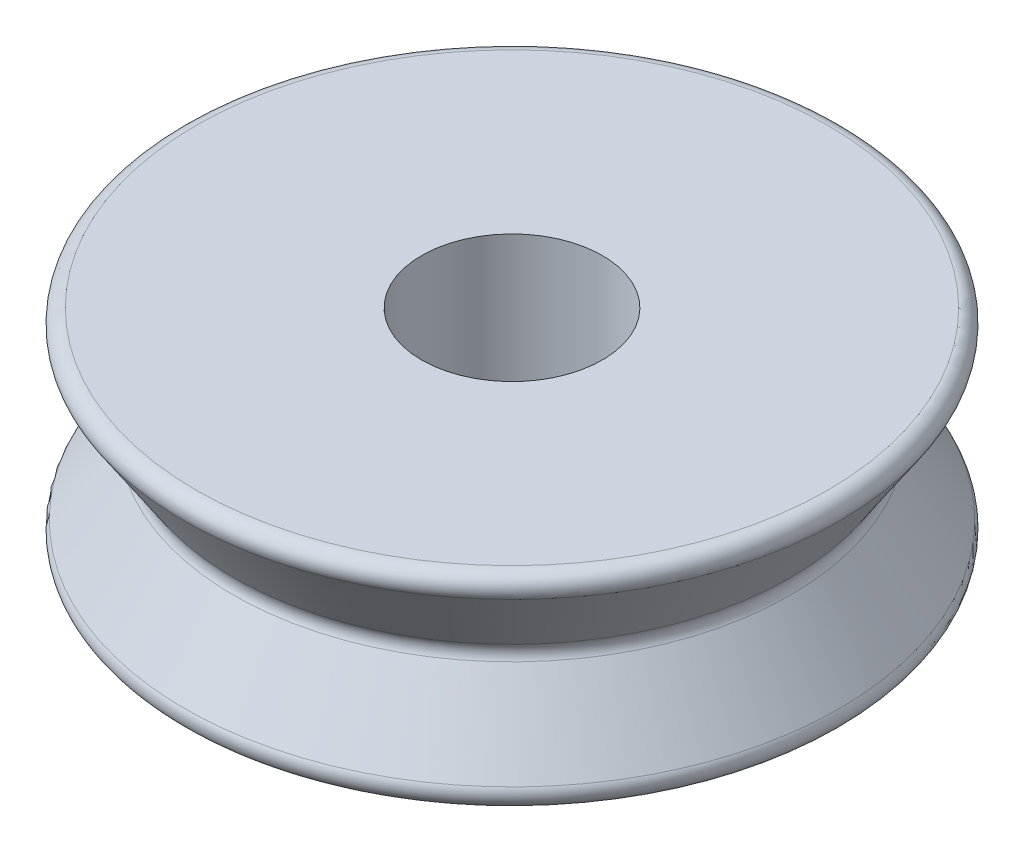
ISO-10303-21;
HEADER;
FILE_DESCRIPTION(('STEP AP214'),'2;1');
FILE_NAME('part.step','',(''),(''),'','','');
FILE_SCHEMA(('AUTOMOTIVE_DESIGN { 1 0 10303 214 1 1 1 1 }'));
ENDSEC;
DATA;
#1=APPLICATION_CONTEXT('core data for automotive mechanical design processes');
#2=APPLICATION_PROTOCOL_DEFINITION('international standard','automotive_design',2000,#1);
#3=PRODUCT_CONTEXT('',#1,'mechanical');
#4=PRODUCT('Part','Part','',(#3));
#5=PRODUCT_RELATED_PRODUCT_CATEGORY('part','',(#4));
#6=PRODUCT_DEFINITION_FORMATION('','',#4);
#7=PRODUCT_DEFINITION_CONTEXT('part definition',#1,'design');
#8=PRODUCT_DEFINITION('design','',#6,#7);
#9=PRODUCT_DEFINITION_SHAPE('','',#8);
#10=(LENGTH_UNIT() NAMED_UNIT(*) SI_UNIT(.MILLI.,.METRE.));
#11=(NAMED_UNIT(*) PLANE_ANGLE_UNIT() SI_UNIT($,.RADIAN.));
#12=(NAMED_UNIT(*) SI_UNIT($,.STERADIAN.) SOLID_ANGLE_UNIT());
#13=UNCERTAINTY_MEASURE_WITH_UNIT(LENGTH_MEASURE(1.E-05),#10,'distance_accuracy_value','');
#14=(GEOMETRIC_REPRESENTATION_CONTEXT(3) GLOBAL_UNCERTAINTY_ASSIGNED_CONTEXT((#13)) GLOBAL_UNIT_ASSIGNED_CONTEXT((#10,
#11,#12)) REPRESENTATION_CONTEXT('',''));
#15=CARTESIAN_POINT('',(0.,0.,0.));
#16=DIRECTION('',(0.,0.,1.));
#17=DIRECTION('',(1.,0.,0.));
#18=AXIS2_PLACEMENT_3D('',#15,#16,#17);
#19=CARTESIAN_POINT('',(-10.,3.,0.));
#20=DIRECTION('',(0.,1.,0.));
#21=DIRECTION('',(-1.,0.,0.));
#22=AXIS2_PLACEMENT_3D('',#19,#20,#21);
#23=PLANE('',#22);
#24=CARTESIAN_POINT('',(0.,3.,0.));
#25=DIRECTION('',(0.,1.,0.));
#26=DIRECTION('',(0.,0.,1.));
#27=AXIS2_PLACEMENT_3D('',#24,#25,#26);
#28=CIRCLE('',#27,2.65);
#29=CARTESIAN_POINT('',(0.,3.,2.65));
#30=VERTEX_POINT('',#29);
#31=EDGE_CURVE('E72',#30,#30,#28,.T.);
#32=ORIENTED_EDGE('',*,*,#31,.F.);
#33=EDGE_LOOP('',(#32));
#34=FACE_BOUND('',#33,.T.);
#35=CARTESIAN_POINT('',(0.,3.,0.));
#36=DIRECTION('',(0.,1.,0.));
#37=DIRECTION('',(-1.,0.,0.));
#38=AXIS2_PLACEMENT_3D('',#35,#36,#37);
#39=CIRCLE('',#38,9.25259316327147);
#40=CARTESIAN_POINT('',(-9.25259316327147,3.,0.));
#41=VERTEX_POINT('',#40);
#42=EDGE_CURVE('E65',#41,#41,#39,.T.);
#43=ORIENTED_EDGE('',*,*,#42,.T.);
#44=EDGE_LOOP('',(#43));
#45=FACE_BOUND('',#44,.T.);
#46=ADVANCED_FACE('F36',(#34,#45),#23,.T.);
#47=CARTESIAN_POINT('',(-10.,-3.,0.));
#48=DIRECTION('',(0.,-1.,0.));
#49=DIRECTION('',(1.,0.,0.));
#50=AXIS2_PLACEMENT_3D('',#47,#48,#49);
#51=PLANE('',#50);
#52=CARTESIAN_POINT('',(0.,-3.00000000000001,0.));
#53=DIRECTION('',(0.,1.,0.));
#54=DIRECTION('',(0.,0.,1.));
#55=AXIS2_PLACEMENT_3D('',#52,#53,#54);
#56=CIRCLE('',#55,2.65);
#57=CARTESIAN_POINT('',(0.,-3.00000000000001,2.65));
#58=VERTEX_POINT('',#57);
#59=EDGE_CURVE('E69',#58,#58,#56,.T.);
#60=ORIENTED_EDGE('',*,*,#59,.T.);
#61=EDGE_LOOP('',(#60));
#62=FACE_BOUND('',#61,.T.);
#63=CARTESIAN_POINT('',(0.,-3.,0.));
#64=DIRECTION('',(0.,-1.,0.));
#65=DIRECTION('',(1.,0.,0.));
#66=AXIS2_PLACEMENT_3D('',#63,#64,#65);
#67=CIRCLE('',#66,9.25259316327147);
#68=CARTESIAN_POINT('',(9.25259316327147,-3.,0.));
#69=VERTEX_POINT('',#68);
#70=EDGE_CURVE('E10',#69,#69,#67,.T.);
#71=ORIENTED_EDGE('',*,*,#70,.T.);
#72=EDGE_LOOP('',(#71));
#73=FACE_BOUND('',#72,.T.);
#74=ADVANCED_FACE('F81',(#62,#73),#51,.T.);
#75=CARTESIAN_POINT('',(0.,0.,0.));
#76=DIRECTION('',(0.,-1.,0.));
#77=DIRECTION('',(1.,0.,0.));
#78=AXIS2_PLACEMENT_3D('',#75,#76,#77);
#79=CONICAL_SURFACE('',#78,8.,0.588002603547567);
#80=CARTESIAN_POINT('',(0.,-0.221880078490088,0.));
#81=DIRECTION('',(0.,-1.,0.));
#82=DIRECTION('',(1.,0.,0.));
#83=AXIS2_PLACEMENT_3D('',#80,#81,#82);
#84=CIRCLE('',#83,8.14792005232673);
#85=CARTESIAN_POINT('',(8.14792005232673,-0.221880078490086,0.));
#86=VERTEX_POINT('',#85);
#87=EDGE_CURVE('E44',#86,#86,#84,.T.);
#88=ORIENTED_EDGE('',*,*,#87,.T.);
#89=EDGE_LOOP('',(#88));
#90=FACE_BOUND('',#89,.T.);
#91=CARTESIAN_POINT('',(0.,-2.37811992150991,0.));
#92=DIRECTION('',(0.,1.,0.));
#93=DIRECTION('',(-1.,0.,0.));
#94=AXIS2_PLACEMENT_3D('',#91,#92,#93);
#95=CIRCLE('',#94,9.5854132810066);
#96=CARTESIAN_POINT('',(-9.5854132810066,-2.37811992150991,0.));
#97=VERTEX_POINT('',#96);
#98=EDGE_CURVE('E51',#97,#97,#95,.T.);
#99=ORIENTED_EDGE('',*,*,#98,.T.);
#100=EDGE_LOOP('',(#99));
#101=FACE_BOUND('',#100,.T.);
#102=ADVANCED_FACE('F96',(#90,#101),#79,.T.);
#103=CARTESIAN_POINT('',(0.,3.,0.));
#104=DIRECTION('',(0.,1.,0.));
#105=DIRECTION('',(-1.,0.,0.));
#106=AXIS2_PLACEMENT_3D('',#103,#104,#105);
#107=CONICAL_SURFACE('',#106,10.,0.588002603547568);
#108=CARTESIAN_POINT('',(0.,2.37811992150991,0.));
#109=DIRECTION('',(0.,-1.,0.));
#110=DIRECTION('',(1.,0.,0.));
#111=AXIS2_PLACEMENT_3D('',#108,#109,#110);
#112=CIRCLE('',#111,9.5854132810066);
#113=CARTESIAN_POINT('',(9.5854132810066,2.37811992150991,0.));
#114=VERTEX_POINT('',#113);
#115=EDGE_CURVE('E56',#114,#114,#112,.T.);
#116=ORIENTED_EDGE('',*,*,#115,.T.);
#117=EDGE_LOOP('',(#116));
#118=FACE_BOUND('',#117,.T.);
#119=CARTESIAN_POINT('',(0.,0.221880078490094,0.));
#120=DIRECTION('',(0.,1.,0.));
#121=DIRECTION('',(-1.,0.,0.));
#122=AXIS2_PLACEMENT_3D('',#119,#120,#121);
#123=CIRCLE('',#122,8.14792005232673);
#124=CARTESIAN_POINT('',(-8.14792005232673,0.221880078490091,0.));
#125=VERTEX_POINT('',#124);
#126=EDGE_CURVE('E62',#125,#125,#123,.T.);
#127=ORIENTED_EDGE('',*,*,#126,.T.);
#128=EDGE_LOOP('',(#127));
#129=FACE_BOUND('',#128,.T.);
#130=ADVANCED_FACE('F88',(#118,#129),#107,.T.);
#131=CARTESIAN_POINT('',(0.,2.6,0.));
#132=DIRECTION('',(0.,1.,0.));
#133=DIRECTION('',(-1.,0.,0.));
#134=AXIS2_PLACEMENT_3D('',#131,#132,#133);
#135=TOROIDAL_SURFACE('',#134,9.25259316327147,0.4);
#136=ORIENTED_EDGE('',*,*,#115,.F.);
#137=EDGE_LOOP('',(#136));
#138=FACE_BOUND('',#137,.T.);
#139=ORIENTED_EDGE('',*,*,#42,.F.);
#140=EDGE_LOOP('',(#139));
#141=FACE_BOUND('',#140,.T.);
#142=ADVANCED_FACE('F85',(#138,#141),#135,.T.);
#143=CARTESIAN_POINT('',(0.,0.,0.));
#144=DIRECTION('',(0.,1.,0.));
#145=DIRECTION('',(-1.,0.,0.));
#146=AXIS2_PLACEMENT_3D('',#143,#144,#145);
#147=TOROIDAL_SURFACE('',#146,8.48074017006186,0.4);
#148=ORIENTED_EDGE('',*,*,#87,.F.);
#149=EDGE_LOOP('',(#148));
#150=FACE_BOUND('',#149,.T.);
#151=ORIENTED_EDGE('',*,*,#126,.F.);
#152=EDGE_LOOP('',(#151));
#153=FACE_BOUND('',#152,.T.);
#154=ADVANCED_FACE('F87',(#150,#153),#147,.F.);
#155=CARTESIAN_POINT('',(0.,-2.6,0.));
#156=DIRECTION('',(0.,-1.,0.));
#157=DIRECTION('',(1.,0.,0.));
#158=AXIS2_PLACEMENT_3D('',#155,#156,#157);
#159=TOROIDAL_SURFACE('',#158,9.25259316327147,0.4);
#160=ORIENTED_EDGE('',*,*,#70,.F.);
#161=EDGE_LOOP('',(#160));
#162=FACE_BOUND('',#161,.T.);
#163=ORIENTED_EDGE('',*,*,#98,.F.);
#164=EDGE_LOOP('',(#163));
#165=FACE_BOUND('',#164,.T.);
#166=ADVANCED_FACE('F38',(#162,#165),#159,.T.);
#167=CARTESIAN_POINT('',(0.,3.,0.));
#168=DIRECTION('',(0.,1.,0.));
#169=DIRECTION('',(0.,0.,1.));
#170=AXIS2_PLACEMENT_3D('',#167,#168,#169);
#171=CYLINDRICAL_SURFACE('',#170,2.65);
#172=ORIENTED_EDGE('',*,*,#59,.F.);
#173=EDGE_LOOP('',(#172));
#174=FACE_BOUND('',#173,.T.);
#175=ORIENTED_EDGE('',*,*,#31,.T.);
#176=EDGE_LOOP('',(#175));
#177=FACE_BOUND('',#176,.T.);
#178=ADVANCED_FACE('F77',(#174,#177),#171,.F.);
#179=CLOSED_SHELL('',(#46,#74,#102,#130,#142,#154,#166,#178));
#180=MANIFOLD_SOLID_BREP('B2',#179);
#181=ADVANCED_BREP_SHAPE_REPRESENTATION('',(#18,#180),#14);
#182=SHAPE_DEFINITION_REPRESENTATION(#9,#181);
ENDSEC;
END-ISO-10303-21;
